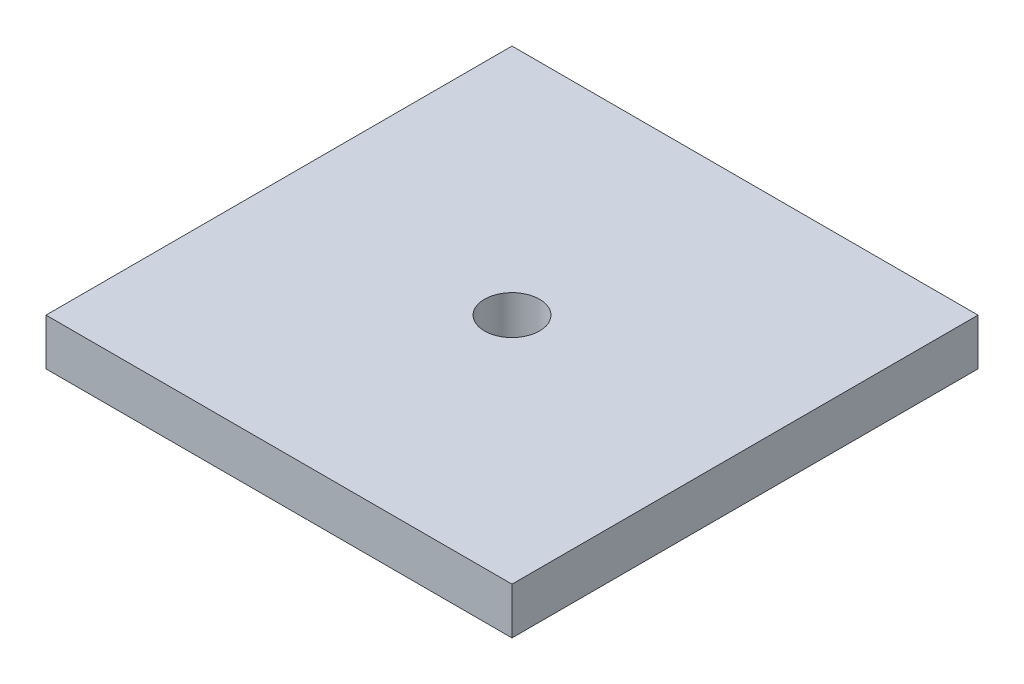
ISO-10303-21;
HEADER;
FILE_DESCRIPTION(('STEP AP214'),'2;1');
FILE_NAME('part.step','',(''),(''),'','','');
FILE_SCHEMA(('AUTOMOTIVE_DESIGN { 1 0 10303 214 1 1 1 1 }'));
ENDSEC;
DATA;
#1=APPLICATION_CONTEXT('core data for automotive mechanical design processes');
#2=APPLICATION_PROTOCOL_DEFINITION('international standard','automotive_design',2000,#1);
#3=PRODUCT_CONTEXT('',#1,'mechanical');
#4=PRODUCT('Part','Part','',(#3));
#5=PRODUCT_RELATED_PRODUCT_CATEGORY('part','',(#4));
#6=PRODUCT_DEFINITION_FORMATION('','',#4);
#7=PRODUCT_DEFINITION_CONTEXT('part definition',#1,'design');
#8=PRODUCT_DEFINITION('design','',#6,#7);
#9=PRODUCT_DEFINITION_SHAPE('','',#8);
#10=(LENGTH_UNIT() NAMED_UNIT(*) SI_UNIT(.MILLI.,.METRE.));
#11=(NAMED_UNIT(*) PLANE_ANGLE_UNIT() SI_UNIT($,.RADIAN.));
#12=(NAMED_UNIT(*) SI_UNIT($,.STERADIAN.) SOLID_ANGLE_UNIT());
#13=UNCERTAINTY_MEASURE_WITH_UNIT(LENGTH_MEASURE(1.E-05),#10,'distance_accuracy_value','');
#14=(GEOMETRIC_REPRESENTATION_CONTEXT(3) GLOBAL_UNCERTAINTY_ASSIGNED_CONTEXT((#13)) GLOBAL_UNIT_ASSIGNED_CONTEXT((#10,
#11,#12)) REPRESENTATION_CONTEXT('',''));
#15=CARTESIAN_POINT('',(0.,0.,0.));
#16=DIRECTION('',(0.,0.,1.));
#17=DIRECTION('',(1.,0.,0.));
#18=AXIS2_PLACEMENT_3D('',#15,#16,#17);
#19=CARTESIAN_POINT('',(0.,12.7,0.));
#20=DIRECTION('',(0.,1.,0.));
#21=DIRECTION('',(0.,0.,1.));
#22=AXIS2_PLACEMENT_3D('',#19,#20,#21);
#23=PLANE('',#22);
#24=DIRECTION('',(0.,0.,1.));
#25=VECTOR('',#24,1.);
#26=CARTESIAN_POINT('',(-63.5,12.7,63.5));
#27=LINE('',#26,#25);
#28=CARTESIAN_POINT('',(-63.5,12.7,-63.5));
#29=VERTEX_POINT('',#28);
#30=CARTESIAN_POINT('',(-63.5,12.7,63.5));
#31=VERTEX_POINT('',#30);
#32=EDGE_CURVE('E93',#29,#31,#27,.T.);
#33=ORIENTED_EDGE('',*,*,#32,.T.);
#34=DIRECTION('',(1.,0.,0.));
#35=VECTOR('',#34,1.);
#36=CARTESIAN_POINT('',(63.5,12.7,63.5));
#37=LINE('',#36,#35);
#38=CARTESIAN_POINT('',(63.5,12.7,63.5));
#39=VERTEX_POINT('',#38);
#40=EDGE_CURVE('E88',#31,#39,#37,.T.);
#41=ORIENTED_EDGE('',*,*,#40,.T.);
#42=DIRECTION('',(0.,0.,-1.));
#43=VECTOR('',#42,1.);
#44=CARTESIAN_POINT('',(63.5,12.7,63.5));
#45=LINE('',#44,#43);
#46=CARTESIAN_POINT('',(63.5,12.7,-63.5));
#47=VERTEX_POINT('',#46);
#48=EDGE_CURVE('E91',#39,#47,#45,.T.);
#49=ORIENTED_EDGE('',*,*,#48,.T.);
#50=DIRECTION('',(-1.,0.,0.));
#51=VECTOR('',#50,1.);
#52=CARTESIAN_POINT('',(63.5,12.7,-63.5));
#53=LINE('',#52,#51);
#54=EDGE_CURVE('E58',#47,#29,#53,.T.);
#55=ORIENTED_EDGE('',*,*,#54,.T.);
#56=EDGE_LOOP('',(#33,#41,#49,#55));
#57=FACE_BOUND('',#56,.T.);
#58=CARTESIAN_POINT('',(0.,12.7,0.));
#59=DIRECTION('',(0.,1.,0.));
#60=DIRECTION('',(0.,0.,1.));
#61=AXIS2_PLACEMENT_3D('',#58,#59,#60);
#62=CIRCLE('',#61,7.5057);
#63=CARTESIAN_POINT('',(0.,12.7,7.5057));
#64=VERTEX_POINT('',#63);
#65=EDGE_CURVE('E108',#64,#64,#62,.T.);
#66=ORIENTED_EDGE('',*,*,#65,.F.);
#67=EDGE_LOOP('',(#66));
#68=FACE_BOUND('',#67,.T.);
#69=ADVANCED_FACE('F41',(#57,#68),#23,.T.);
#70=CARTESIAN_POINT('',(0.,0.,0.));
#71=DIRECTION('',(0.,1.,0.));
#72=DIRECTION('',(0.,0.,1.));
#73=AXIS2_PLACEMENT_3D('',#70,#71,#72);
#74=PLANE('',#73);
#75=DIRECTION('',(0.,0.,1.));
#76=VECTOR('',#75,1.);
#77=CARTESIAN_POINT('',(-63.5,0.,63.5));
#78=LINE('',#77,#76);
#79=CARTESIAN_POINT('',(-63.5,0.,-63.5));
#80=VERTEX_POINT('',#79);
#81=CARTESIAN_POINT('',(-63.5,0.,63.5));
#82=VERTEX_POINT('',#81);
#83=EDGE_CURVE('E105',#80,#82,#78,.T.);
#84=ORIENTED_EDGE('',*,*,#83,.F.);
#85=DIRECTION('',(-1.,0.,0.));
#86=VECTOR('',#85,1.);
#87=CARTESIAN_POINT('',(63.5,0.,-63.5));
#88=LINE('',#87,#86);
#89=CARTESIAN_POINT('',(63.5,0.,-63.5));
#90=VERTEX_POINT('',#89);
#91=EDGE_CURVE('E81',#90,#80,#88,.T.);
#92=ORIENTED_EDGE('',*,*,#91,.F.);
#93=DIRECTION('',(0.,0.,-1.));
#94=VECTOR('',#93,1.);
#95=CARTESIAN_POINT('',(63.5,0.,63.5));
#96=LINE('',#95,#94);
#97=CARTESIAN_POINT('',(63.5,0.,63.5));
#98=VERTEX_POINT('',#97);
#99=EDGE_CURVE('E75',#98,#90,#96,.T.);
#100=ORIENTED_EDGE('',*,*,#99,.F.);
#101=DIRECTION('',(1.,0.,0.));
#102=VECTOR('',#101,1.);
#103=CARTESIAN_POINT('',(63.5,0.,63.5));
#104=LINE('',#103,#102);
#105=EDGE_CURVE('E97',#82,#98,#104,.T.);
#106=ORIENTED_EDGE('',*,*,#105,.F.);
#107=EDGE_LOOP('',(#84,#92,#100,#106));
#108=FACE_BOUND('',#107,.T.);
#109=CARTESIAN_POINT('',(0.,0.,0.));
#110=DIRECTION('',(0.,1.,0.));
#111=DIRECTION('',(0.,0.,1.));
#112=AXIS2_PLACEMENT_3D('',#109,#110,#111);
#113=CIRCLE('',#112,7.5057);
#114=CARTESIAN_POINT('',(0.,0.,7.5057));
#115=VERTEX_POINT('',#114);
#116=EDGE_CURVE('E120',#115,#115,#113,.T.);
#117=ORIENTED_EDGE('',*,*,#116,.T.);
#118=EDGE_LOOP('',(#117));
#119=FACE_BOUND('',#118,.T.);
#120=ADVANCED_FACE('F116',(#108,#119),#74,.F.);
#121=CARTESIAN_POINT('',(-63.5,12.7,63.5));
#122=DIRECTION('',(1.,0.,0.));
#123=DIRECTION('',(0.,0.,-1.));
#124=AXIS2_PLACEMENT_3D('',#121,#122,#123);
#125=PLANE('',#124);
#126=ORIENTED_EDGE('',*,*,#83,.T.);
#127=DIRECTION('',(0.,-1.,0.));
#128=VECTOR('',#127,1.);
#129=CARTESIAN_POINT('',(-63.5,12.7,63.5));
#130=LINE('',#129,#128);
#131=EDGE_CURVE('E11',#31,#82,#130,.T.);
#132=ORIENTED_EDGE('',*,*,#131,.F.);
#133=ORIENTED_EDGE('',*,*,#32,.F.);
#134=DIRECTION('',(0.,-1.,0.));
#135=VECTOR('',#134,1.);
#136=CARTESIAN_POINT('',(-63.5,12.7,-63.5));
#137=LINE('',#136,#135);
#138=EDGE_CURVE('E101',#29,#80,#137,.T.);
#139=ORIENTED_EDGE('',*,*,#138,.T.);
#140=EDGE_LOOP('',(#126,#132,#133,#139));
#141=FACE_BOUND('',#140,.T.);
#142=ADVANCED_FACE('F43',(#141),#125,.F.);
#143=CARTESIAN_POINT('',(63.5,12.7,63.5));
#144=DIRECTION('',(0.,0.,-1.));
#145=DIRECTION('',(-1.,0.,0.));
#146=AXIS2_PLACEMENT_3D('',#143,#144,#145);
#147=PLANE('',#146);
#148=ORIENTED_EDGE('',*,*,#105,.T.);
#149=DIRECTION('',(0.,-1.,0.));
#150=VECTOR('',#149,1.);
#151=CARTESIAN_POINT('',(63.5,12.7,63.5));
#152=LINE('',#151,#150);
#153=EDGE_CURVE('E50',#39,#98,#152,.T.);
#154=ORIENTED_EDGE('',*,*,#153,.F.);
#155=ORIENTED_EDGE('',*,*,#40,.F.);
#156=ORIENTED_EDGE('',*,*,#131,.T.);
#157=EDGE_LOOP('',(#148,#154,#155,#156));
#158=FACE_BOUND('',#157,.T.);
#159=ADVANCED_FACE('F96',(#158),#147,.F.);
#160=CARTESIAN_POINT('',(63.5,12.7,63.5));
#161=DIRECTION('',(-1.,0.,0.));
#162=DIRECTION('',(0.,0.,1.));
#163=AXIS2_PLACEMENT_3D('',#160,#161,#162);
#164=PLANE('',#163);
#165=ORIENTED_EDGE('',*,*,#99,.T.);
#166=DIRECTION('',(0.,-1.,0.));
#167=VECTOR('',#166,1.);
#168=CARTESIAN_POINT('',(63.5,12.7,-63.5));
#169=LINE('',#168,#167);
#170=EDGE_CURVE('E98',#47,#90,#169,.T.);
#171=ORIENTED_EDGE('',*,*,#170,.F.);
#172=ORIENTED_EDGE('',*,*,#48,.F.);
#173=ORIENTED_EDGE('',*,*,#153,.T.);
#174=EDGE_LOOP('',(#165,#171,#172,#173));
#175=FACE_BOUND('',#174,.T.);
#176=ADVANCED_FACE('F99',(#175),#164,.F.);
#177=CARTESIAN_POINT('',(63.5,12.7,-63.5));
#178=DIRECTION('',(0.,0.,1.));
#179=DIRECTION('',(1.,0.,0.));
#180=AXIS2_PLACEMENT_3D('',#177,#178,#179);
#181=PLANE('',#180);
#182=ORIENTED_EDGE('',*,*,#91,.T.);
#183=ORIENTED_EDGE('',*,*,#138,.F.);
#184=ORIENTED_EDGE('',*,*,#54,.F.);
#185=ORIENTED_EDGE('',*,*,#170,.T.);
#186=EDGE_LOOP('',(#182,#183,#184,#185));
#187=FACE_BOUND('',#186,.T.);
#188=ADVANCED_FACE('F113',(#187),#181,.F.);
#189=CARTESIAN_POINT('',(0.,12.7,0.));
#190=DIRECTION('',(0.,-1.,0.));
#191=DIRECTION('',(0.,0.,-1.));
#192=AXIS2_PLACEMENT_3D('',#189,#190,#191);
#193=CYLINDRICAL_SURFACE('',#192,7.5057);
#194=ORIENTED_EDGE('',*,*,#65,.T.);
#195=EDGE_LOOP('',(#194));
#196=FACE_BOUND('',#195,.T.);
#197=ORIENTED_EDGE('',*,*,#116,.F.);
#198=EDGE_LOOP('',(#197));
#199=FACE_BOUND('',#198,.T.);
#200=ADVANCED_FACE('F126',(#196,#199),#193,.F.);
#201=CLOSED_SHELL('',(#69,#120,#142,#159,#176,#188,#200));
#202=MANIFOLD_SOLID_BREP('B2',#201);
#203=ADVANCED_BREP_SHAPE_REPRESENTATION('',(#18,#202),#14);
#204=SHAPE_DEFINITION_REPRESENTATION(#9,#203);
ENDSEC;
END-ISO-10303-21;
